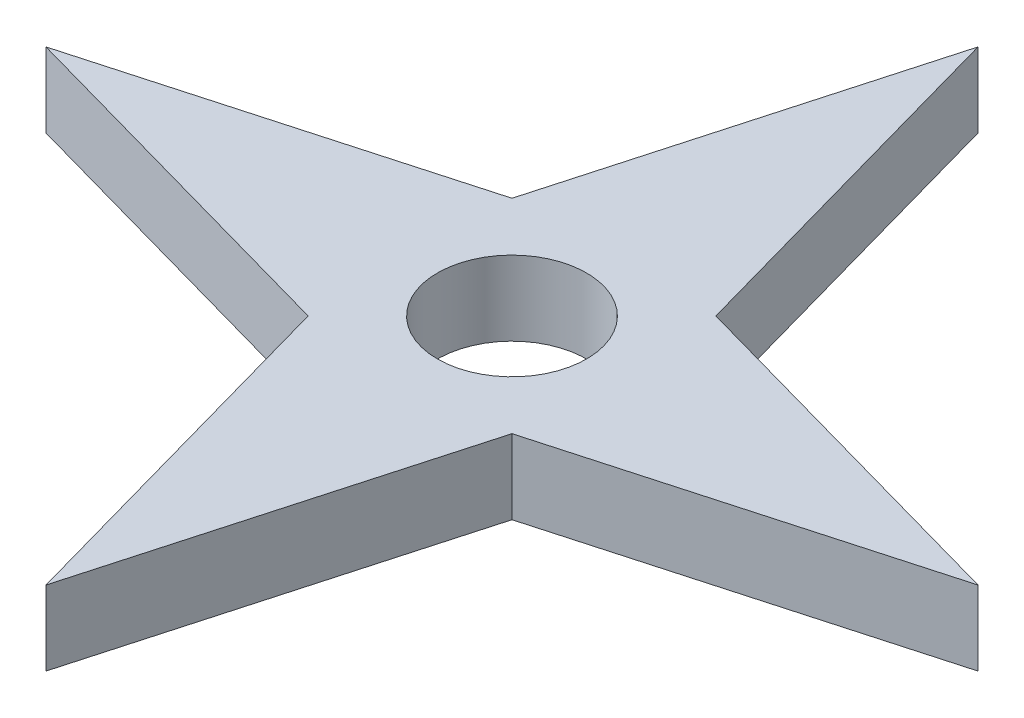
ISO-10303-21;
HEADER;
FILE_DESCRIPTION(('STEP AP214'),'2;1');
FILE_NAME('part.step','',(''),(''),'','','');
FILE_SCHEMA(('AUTOMOTIVE_DESIGN { 1 0 10303 214 1 1 1 1 }'));
ENDSEC;
DATA;
#1=APPLICATION_CONTEXT('core data for automotive mechanical design processes');
#2=APPLICATION_PROTOCOL_DEFINITION('international standard','automotive_design',2000,#1);
#3=PRODUCT_CONTEXT('',#1,'mechanical');
#4=PRODUCT('Part','Part','',(#3));
#5=PRODUCT_RELATED_PRODUCT_CATEGORY('part','',(#4));
#6=PRODUCT_DEFINITION_FORMATION('','',#4);
#7=PRODUCT_DEFINITION_CONTEXT('part definition',#1,'design');
#8=PRODUCT_DEFINITION('design','',#6,#7);
#9=PRODUCT_DEFINITION_SHAPE('','',#8);
#10=(LENGTH_UNIT() NAMED_UNIT(*) SI_UNIT(.MILLI.,.METRE.));
#11=(NAMED_UNIT(*) PLANE_ANGLE_UNIT() SI_UNIT($,.RADIAN.));
#12=(NAMED_UNIT(*) SI_UNIT($,.STERADIAN.) SOLID_ANGLE_UNIT());
#13=UNCERTAINTY_MEASURE_WITH_UNIT(LENGTH_MEASURE(1.E-05),#10,'distance_accuracy_value','');
#14=(GEOMETRIC_REPRESENTATION_CONTEXT(3) GLOBAL_UNCERTAINTY_ASSIGNED_CONTEXT((#13)) GLOBAL_UNIT_ASSIGNED_CONTEXT((#10,
#11,#12)) REPRESENTATION_CONTEXT('',''));
#15=CARTESIAN_POINT('',(0.,0.,0.));
#16=DIRECTION('',(0.,0.,1.));
#17=DIRECTION('',(1.,0.,0.));
#18=AXIS2_PLACEMENT_3D('',#15,#16,#17);
#19=CARTESIAN_POINT('',(0.,20.,0.));
#20=DIRECTION('',(0.,1.,0.));
#21=DIRECTION('',(0.,0.,1.));
#22=AXIS2_PLACEMENT_3D('',#19,#20,#21);
#23=PLANE('',#22);
#24=DIRECTION('',(0.269629925519971,0.,-0.962964019714182));
#25=VECTOR('',#24,1.);
#26=CARTESIAN_POINT('',(0.,20.,125.));
#27=LINE('',#26,#25);
#28=CARTESIAN_POINT('',(0.,20.,125.));
#29=VERTEX_POINT('',#28);
#30=CARTESIAN_POINT('',(27.34375,20.,27.34375));
#31=VERTEX_POINT('',#30);
#32=EDGE_CURVE('E121',#29,#31,#27,.T.);
#33=ORIENTED_EDGE('',*,*,#32,.T.);
#34=DIRECTION('',(-0.962964019714182,0.,0.269629925519971));
#35=VECTOR('',#34,1.);
#36=CARTESIAN_POINT('',(125.,20.,0.));
#37=LINE('',#36,#35);
#38=CARTESIAN_POINT('',(125.,20.,0.));
#39=VERTEX_POINT('',#38);
#40=EDGE_CURVE('E221',#39,#31,#37,.T.);
#41=ORIENTED_EDGE('',*,*,#40,.F.);
#42=DIRECTION('',(-0.962964019714182,0.,-0.269629925519971));
#43=VECTOR('',#42,1.);
#44=CARTESIAN_POINT('',(125.,20.,0.));
#45=LINE('',#44,#43);
#46=CARTESIAN_POINT('',(27.34375,20.,-27.34375));
#47=VERTEX_POINT('',#46);
#48=EDGE_CURVE('E212',#39,#47,#45,.T.);
#49=ORIENTED_EDGE('',*,*,#48,.T.);
#50=DIRECTION('',(-0.269629925519971,0.,-0.962964019714182));
#51=VECTOR('',#50,1.);
#52=CARTESIAN_POINT('',(27.34375,20.,-27.34375));
#53=LINE('',#52,#51);
#54=CARTESIAN_POINT('',(0.,20.,-125.));
#55=VERTEX_POINT('',#54);
#56=EDGE_CURVE('E318',#47,#55,#53,.T.);
#57=ORIENTED_EDGE('',*,*,#56,.T.);
#58=DIRECTION('',(0.269629925519971,0.,-0.962964019714182));
#59=VECTOR('',#58,1.);
#60=CARTESIAN_POINT('',(-27.34375,20.,-27.34375));
#61=LINE('',#60,#59);
#62=CARTESIAN_POINT('',(-27.34375,20.,-27.34375));
#63=VERTEX_POINT('',#62);
#64=EDGE_CURVE('E144',#63,#55,#61,.T.);
#65=ORIENTED_EDGE('',*,*,#64,.F.);
#66=DIRECTION('',(-0.962964019714182,0.,0.269629925519971));
#67=VECTOR('',#66,1.);
#68=CARTESIAN_POINT('',(-27.34375,20.,-27.34375));
#69=LINE('',#68,#67);
#70=CARTESIAN_POINT('',(-125.,20.,0.));
#71=VERTEX_POINT('',#70);
#72=EDGE_CURVE('E138',#63,#71,#69,.T.);
#73=ORIENTED_EDGE('',*,*,#72,.T.);
#74=DIRECTION('',(-0.962964019714182,0.,-0.269629925519971));
#75=VECTOR('',#74,1.);
#76=CARTESIAN_POINT('',(-27.34375,20.,27.34375));
#77=LINE('',#76,#75);
#78=CARTESIAN_POINT('',(-27.34375,20.,27.34375));
#79=VERTEX_POINT('',#78);
#80=EDGE_CURVE('E142',#79,#71,#77,.T.);
#81=ORIENTED_EDGE('',*,*,#80,.F.);
#82=DIRECTION('',(-0.269629925519971,0.,-0.962964019714182));
#83=VECTOR('',#82,1.);
#84=CARTESIAN_POINT('',(0.,20.,125.));
#85=LINE('',#84,#83);
#86=EDGE_CURVE('E160',#29,#79,#85,.T.);
#87=ORIENTED_EDGE('',*,*,#86,.F.);
#88=EDGE_LOOP('',(#33,#41,#49,#57,#65,#73,#81,#87));
#89=FACE_BOUND('',#88,.T.);
#90=CARTESIAN_POINT('',(0.,20.,0.));
#91=DIRECTION('',(0.,1.,0.));
#92=DIRECTION('',(0.,0.,1.));
#93=AXIS2_PLACEMENT_3D('',#90,#91,#92);
#94=CIRCLE('',#93,20.);
#95=CARTESIAN_POINT('',(0.,20.,20.));
#96=VERTEX_POINT('',#95);
#97=EDGE_CURVE('E170',#96,#96,#94,.T.);
#98=ORIENTED_EDGE('',*,*,#97,.F.);
#99=EDGE_LOOP('',(#98));
#100=FACE_BOUND('',#99,.T.);
#101=ADVANCED_FACE('F66',(#89,#100),#23,.T.);
#102=CARTESIAN_POINT('',(0.,0.,0.));
#103=DIRECTION('',(0.,1.,0.));
#104=DIRECTION('',(0.,0.,1.));
#105=AXIS2_PLACEMENT_3D('',#102,#103,#104);
#106=PLANE('',#105);
#107=DIRECTION('',(0.269629925519971,0.,-0.962964019714182));
#108=VECTOR('',#107,1.);
#109=CARTESIAN_POINT('',(0.,0.,125.));
#110=LINE('',#109,#108);
#111=CARTESIAN_POINT('',(0.,0.,125.));
#112=VERTEX_POINT('',#111);
#113=CARTESIAN_POINT('',(27.34375,0.,27.34375));
#114=VERTEX_POINT('',#113);
#115=EDGE_CURVE('E166',#112,#114,#110,.T.);
#116=ORIENTED_EDGE('',*,*,#115,.F.);
#117=DIRECTION('',(-0.269629925519971,0.,-0.962964019714182));
#118=VECTOR('',#117,1.);
#119=CARTESIAN_POINT('',(0.,0.,125.));
#120=LINE('',#119,#118);
#121=CARTESIAN_POINT('',(-27.34375,0.,27.34375));
#122=VERTEX_POINT('',#121);
#123=EDGE_CURVE('E190',#112,#122,#120,.T.);
#124=ORIENTED_EDGE('',*,*,#123,.T.);
#125=DIRECTION('',(-0.962964019714182,0.,-0.269629925519971));
#126=VECTOR('',#125,1.);
#127=CARTESIAN_POINT('',(-27.34375,0.,27.34375));
#128=LINE('',#127,#126);
#129=CARTESIAN_POINT('',(-125.,0.,0.));
#130=VERTEX_POINT('',#129);
#131=EDGE_CURVE('E187',#122,#130,#128,.T.);
#132=ORIENTED_EDGE('',*,*,#131,.T.);
#133=DIRECTION('',(-0.962964019714182,0.,0.269629925519971));
#134=VECTOR('',#133,1.);
#135=CARTESIAN_POINT('',(-27.34375,0.,-27.34375));
#136=LINE('',#135,#134);
#137=CARTESIAN_POINT('',(-27.34375,0.,-27.34375));
#138=VERTEX_POINT('',#137);
#139=EDGE_CURVE('E152',#138,#130,#136,.T.);
#140=ORIENTED_EDGE('',*,*,#139,.F.);
#141=DIRECTION('',(0.269629925519971,0.,-0.962964019714182));
#142=VECTOR('',#141,1.);
#143=CARTESIAN_POINT('',(-27.34375,0.,-27.34375));
#144=LINE('',#143,#142);
#145=CARTESIAN_POINT('',(0.,0.,-125.));
#146=VERTEX_POINT('',#145);
#147=EDGE_CURVE('E181',#138,#146,#144,.T.);
#148=ORIENTED_EDGE('',*,*,#147,.T.);
#149=DIRECTION('',(-0.269629925519971,0.,-0.962964019714182));
#150=VECTOR('',#149,1.);
#151=CARTESIAN_POINT('',(27.34375,0.,-27.34375));
#152=LINE('',#151,#150);
#153=CARTESIAN_POINT('',(27.34375,0.,-27.34375));
#154=VERTEX_POINT('',#153);
#155=EDGE_CURVE('E177',#154,#146,#152,.T.);
#156=ORIENTED_EDGE('',*,*,#155,.F.);
#157=DIRECTION('',(-0.962964019714182,0.,-0.269629925519971));
#158=VECTOR('',#157,1.);
#159=CARTESIAN_POINT('',(125.,0.,0.));
#160=LINE('',#159,#158);
#161=CARTESIAN_POINT('',(125.,0.,0.));
#162=VERTEX_POINT('',#161);
#163=EDGE_CURVE('E174',#162,#154,#160,.T.);
#164=ORIENTED_EDGE('',*,*,#163,.F.);
#165=DIRECTION('',(-0.962964019714182,0.,0.269629925519971));
#166=VECTOR('',#165,1.);
#167=CARTESIAN_POINT('',(125.,0.,0.));
#168=LINE('',#167,#166);
#169=EDGE_CURVE('E169',#162,#114,#168,.T.);
#170=ORIENTED_EDGE('',*,*,#169,.T.);
#171=EDGE_LOOP('',(#116,#124,#132,#140,#148,#156,#164,#170));
#172=FACE_BOUND('',#171,.T.);
#173=CARTESIAN_POINT('',(0.,0.,0.));
#174=DIRECTION('',(0.,1.,0.));
#175=DIRECTION('',(0.,0.,1.));
#176=AXIS2_PLACEMENT_3D('',#173,#174,#175);
#177=CIRCLE('',#176,20.);
#178=CARTESIAN_POINT('',(0.,0.,20.));
#179=VERTEX_POINT('',#178);
#180=EDGE_CURVE('E329',#179,#179,#177,.T.);
#181=ORIENTED_EDGE('',*,*,#180,.T.);
#182=EDGE_LOOP('',(#181));
#183=FACE_BOUND('',#182,.T.);
#184=ADVANCED_FACE('F218',(#172,#183),#106,.F.);
#185=CARTESIAN_POINT('',(0.,20.,125.));
#186=DIRECTION('',(-0.962964019714182,0.,-0.269629925519971));
#187=DIRECTION('',(-0.269629925519971,0.,0.962964019714182));
#188=AXIS2_PLACEMENT_3D('',#185,#186,#187);
#189=PLANE('',#188);
#190=ORIENTED_EDGE('',*,*,#115,.T.);
#191=DIRECTION('',(0.,-1.,0.));
#192=VECTOR('',#191,1.);
#193=CARTESIAN_POINT('',(27.34375,20.,27.34375));
#194=LINE('',#193,#192);
#195=EDGE_CURVE('E12',#31,#114,#194,.T.);
#196=ORIENTED_EDGE('',*,*,#195,.F.);
#197=ORIENTED_EDGE('',*,*,#32,.F.);
#198=DIRECTION('',(0.,-1.,0.));
#199=VECTOR('',#198,1.);
#200=CARTESIAN_POINT('',(0.,20.,125.));
#201=LINE('',#200,#199);
#202=EDGE_CURVE('E84',#29,#112,#201,.T.);
#203=ORIENTED_EDGE('',*,*,#202,.T.);
#204=EDGE_LOOP('',(#190,#196,#197,#203));
#205=FACE_BOUND('',#204,.T.);
#206=ADVANCED_FACE('F68',(#205),#189,.F.);
#207=CARTESIAN_POINT('',(125.,20.,0.));
#208=DIRECTION('',(0.269629925519971,0.,0.962964019714182));
#209=DIRECTION('',(0.962964019714182,0.,-0.269629925519971));
#210=AXIS2_PLACEMENT_3D('',#207,#208,#209);
#211=PLANE('',#210);
#212=ORIENTED_EDGE('',*,*,#169,.F.);
#213=DIRECTION('',(0.,-1.,0.));
#214=VECTOR('',#213,1.);
#215=CARTESIAN_POINT('',(125.,20.,0.));
#216=LINE('',#215,#214);
#217=EDGE_CURVE('E76',#39,#162,#216,.T.);
#218=ORIENTED_EDGE('',*,*,#217,.F.);
#219=ORIENTED_EDGE('',*,*,#40,.T.);
#220=ORIENTED_EDGE('',*,*,#195,.T.);
#221=EDGE_LOOP('',(#212,#218,#219,#220));
#222=FACE_BOUND('',#221,.T.);
#223=ADVANCED_FACE('F220',(#222),#211,.T.);
#224=CARTESIAN_POINT('',(125.,20.,0.));
#225=DIRECTION('',(-0.269629925519971,0.,0.962964019714182));
#226=DIRECTION('',(0.962964019714182,0.,0.269629925519971));
#227=AXIS2_PLACEMENT_3D('',#224,#225,#226);
#228=PLANE('',#227);
#229=ORIENTED_EDGE('',*,*,#163,.T.);
#230=DIRECTION('',(0.,-1.,0.));
#231=VECTOR('',#230,1.);
#232=CARTESIAN_POINT('',(27.34375,20.,-27.34375));
#233=LINE('',#232,#231);
#234=EDGE_CURVE('E203',#47,#154,#233,.T.);
#235=ORIENTED_EDGE('',*,*,#234,.F.);
#236=ORIENTED_EDGE('',*,*,#48,.F.);
#237=ORIENTED_EDGE('',*,*,#217,.T.);
#238=EDGE_LOOP('',(#229,#235,#236,#237));
#239=FACE_BOUND('',#238,.T.);
#240=ADVANCED_FACE('F210',(#239),#228,.F.);
#241=CARTESIAN_POINT('',(27.34375,20.,-27.34375));
#242=DIRECTION('',(-0.962964019714182,0.,0.269629925519971));
#243=DIRECTION('',(0.269629925519971,0.,0.962964019714182));
#244=AXIS2_PLACEMENT_3D('',#241,#242,#243);
#245=PLANE('',#244);
#246=ORIENTED_EDGE('',*,*,#155,.T.);
#247=DIRECTION('',(0.,-1.,0.));
#248=VECTOR('',#247,1.);
#249=CARTESIAN_POINT('',(0.,20.,-125.));
#250=LINE('',#249,#248);
#251=EDGE_CURVE('E200',#55,#146,#250,.T.);
#252=ORIENTED_EDGE('',*,*,#251,.F.);
#253=ORIENTED_EDGE('',*,*,#56,.F.);
#254=ORIENTED_EDGE('',*,*,#234,.T.);
#255=EDGE_LOOP('',(#246,#252,#253,#254));
#256=FACE_BOUND('',#255,.T.);
#257=ADVANCED_FACE('F248',(#256),#245,.F.);
#258=CARTESIAN_POINT('',(-27.34375,20.,-27.34375));
#259=DIRECTION('',(-0.962964019714182,0.,-0.269629925519971));
#260=DIRECTION('',(-0.269629925519971,0.,0.962964019714182));
#261=AXIS2_PLACEMENT_3D('',#258,#259,#260);
#262=PLANE('',#261);
#263=ORIENTED_EDGE('',*,*,#147,.F.);
#264=DIRECTION('',(0.,-1.,0.));
#265=VECTOR('',#264,1.);
#266=CARTESIAN_POINT('',(-27.34375,20.,-27.34375));
#267=LINE('',#266,#265);
#268=EDGE_CURVE('E156',#63,#138,#267,.T.);
#269=ORIENTED_EDGE('',*,*,#268,.F.);
#270=ORIENTED_EDGE('',*,*,#64,.T.);
#271=ORIENTED_EDGE('',*,*,#251,.T.);
#272=EDGE_LOOP('',(#263,#269,#270,#271));
#273=FACE_BOUND('',#272,.T.);
#274=ADVANCED_FACE('F253',(#273),#262,.T.);
#275=CARTESIAN_POINT('',(-27.34375,20.,-27.34375));
#276=DIRECTION('',(0.269629925519971,0.,0.962964019714182));
#277=DIRECTION('',(0.962964019714182,0.,-0.269629925519971));
#278=AXIS2_PLACEMENT_3D('',#275,#276,#277);
#279=PLANE('',#278);
#280=ORIENTED_EDGE('',*,*,#139,.T.);
#281=DIRECTION('',(0.,-1.,0.));
#282=VECTOR('',#281,1.);
#283=CARTESIAN_POINT('',(-125.,20.,0.));
#284=LINE('',#283,#282);
#285=EDGE_CURVE('E149',#71,#130,#284,.T.);
#286=ORIENTED_EDGE('',*,*,#285,.F.);
#287=ORIENTED_EDGE('',*,*,#72,.F.);
#288=ORIENTED_EDGE('',*,*,#268,.T.);
#289=EDGE_LOOP('',(#280,#286,#287,#288));
#290=FACE_BOUND('',#289,.T.);
#291=ADVANCED_FACE('F150',(#290),#279,.F.);
#292=CARTESIAN_POINT('',(-27.34375,20.,27.34375));
#293=DIRECTION('',(-0.269629925519971,0.,0.962964019714182));
#294=DIRECTION('',(0.962964019714182,0.,0.269629925519971));
#295=AXIS2_PLACEMENT_3D('',#292,#293,#294);
#296=PLANE('',#295);
#297=ORIENTED_EDGE('',*,*,#131,.F.);
#298=DIRECTION('',(0.,-1.,0.));
#299=VECTOR('',#298,1.);
#300=CARTESIAN_POINT('',(-27.34375,20.,27.34375));
#301=LINE('',#300,#299);
#302=EDGE_CURVE('E109',#79,#122,#301,.T.);
#303=ORIENTED_EDGE('',*,*,#302,.F.);
#304=ORIENTED_EDGE('',*,*,#80,.T.);
#305=ORIENTED_EDGE('',*,*,#285,.T.);
#306=EDGE_LOOP('',(#297,#303,#304,#305));
#307=FACE_BOUND('',#306,.T.);
#308=ADVANCED_FACE('F158',(#307),#296,.T.);
#309=CARTESIAN_POINT('',(0.,20.,125.));
#310=DIRECTION('',(-0.962964019714182,0.,0.269629925519971));
#311=DIRECTION('',(0.269629925519971,0.,0.962964019714182));
#312=AXIS2_PLACEMENT_3D('',#309,#310,#311);
#313=PLANE('',#312);
#314=ORIENTED_EDGE('',*,*,#123,.F.);
#315=ORIENTED_EDGE('',*,*,#202,.F.);
#316=ORIENTED_EDGE('',*,*,#86,.T.);
#317=ORIENTED_EDGE('',*,*,#302,.T.);
#318=EDGE_LOOP('',(#314,#315,#316,#317));
#319=FACE_BOUND('',#318,.T.);
#320=ADVANCED_FACE('F222',(#319),#313,.T.);
#321=CARTESIAN_POINT('',(0.,20.,0.));
#322=DIRECTION('',(0.,-1.,0.));
#323=DIRECTION('',(0.,0.,-1.));
#324=AXIS2_PLACEMENT_3D('',#321,#322,#323);
#325=CYLINDRICAL_SURFACE('',#324,20.);
#326=ORIENTED_EDGE('',*,*,#97,.T.);
#327=EDGE_LOOP('',(#326));
#328=FACE_BOUND('',#327,.T.);
#329=ORIENTED_EDGE('',*,*,#180,.F.);
#330=EDGE_LOOP('',(#329));
#331=FACE_BOUND('',#330,.T.);
#332=ADVANCED_FACE('F224',(#328,#331),#325,.F.);
#333=CLOSED_SHELL('',(#101,#184,#206,#223,#240,#257,#274,#291,#308,#320,#332));
#334=MANIFOLD_SOLID_BREP('B2',#333);
#335=ADVANCED_BREP_SHAPE_REPRESENTATION('',(#18,#334),#14);
#336=SHAPE_DEFINITION_REPRESENTATION(#9,#335);
ENDSEC;
END-ISO-10303-21;
